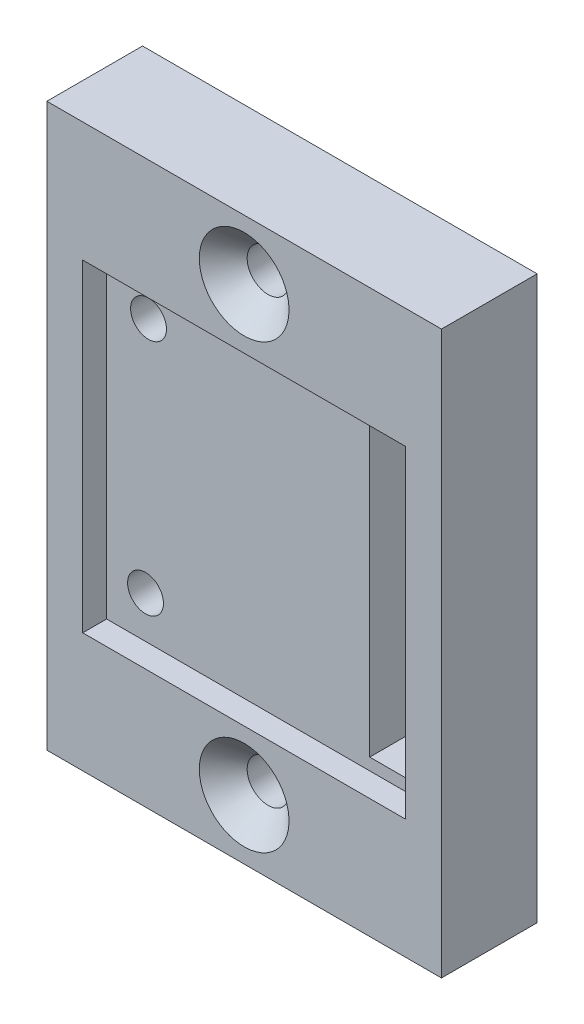
ISO-10303-21;
HEADER;
FILE_DESCRIPTION(('STEP AP214'),'2;1');
FILE_NAME('part.step','',(''),(''),'','','');
FILE_SCHEMA(('AUTOMOTIVE_DESIGN { 1 0 10303 214 1 1 1 1 }'));
ENDSEC;
DATA;
#1=APPLICATION_CONTEXT('core data for automotive mechanical design processes');
#2=APPLICATION_PROTOCOL_DEFINITION('international standard','automotive_design',2000,#1);
#3=PRODUCT_CONTEXT('',#1,'mechanical');
#4=PRODUCT('Part','Part','',(#3));
#5=PRODUCT_RELATED_PRODUCT_CATEGORY('part','',(#4));
#6=PRODUCT_DEFINITION_FORMATION('','',#4);
#7=PRODUCT_DEFINITION_CONTEXT('part definition',#1,'design');
#8=PRODUCT_DEFINITION('design','',#6,#7);
#9=PRODUCT_DEFINITION_SHAPE('','',#8);
#10=(LENGTH_UNIT() NAMED_UNIT(*) SI_UNIT(.MILLI.,.METRE.));
#11=(NAMED_UNIT(*) PLANE_ANGLE_UNIT() SI_UNIT($,.RADIAN.));
#12=(NAMED_UNIT(*) SI_UNIT($,.STERADIAN.) SOLID_ANGLE_UNIT());
#13=UNCERTAINTY_MEASURE_WITH_UNIT(LENGTH_MEASURE(1.E-05),#10,'distance_accuracy_value','');
#14=(GEOMETRIC_REPRESENTATION_CONTEXT(3) GLOBAL_UNCERTAINTY_ASSIGNED_CONTEXT((#13)) GLOBAL_UNIT_ASSIGNED_CONTEXT((#10,
#11,#12)) REPRESENTATION_CONTEXT('',''));
#15=CARTESIAN_POINT('',(0.,0.,0.));
#16=DIRECTION('',(0.,0.,1.));
#17=DIRECTION('',(1.,0.,0.));
#18=AXIS2_PLACEMENT_3D('',#15,#16,#17);
#19=CARTESIAN_POINT('',(6.25,13.5015625610399,-4.));
#20=DIRECTION('',(0.,0.,1.));
#21=DIRECTION('',(1.,0.,0.));
#22=AXIS2_PLACEMENT_3D('',#19,#20,#21);
#23=CYLINDRICAL_SURFACE('',#22,1.5);
#24=CARTESIAN_POINT('',(6.25,13.5015625610399,6.));
#25=DIRECTION('',(0.,0.,1.));
#26=DIRECTION('',(1.,0.,0.));
#27=AXIS2_PLACEMENT_3D('',#24,#25,#26);
#28=CIRCLE('',#27,1.5);
#29=CARTESIAN_POINT('',(7.75,13.5015625610399,6.));
#30=VERTEX_POINT('',#29);
#31=EDGE_CURVE('E326',#30,#30,#28,.T.);
#32=ORIENTED_EDGE('',*,*,#31,.T.);
#33=EDGE_LOOP('',(#32));
#34=FACE_BOUND('',#33,.T.);
#35=CARTESIAN_POINT('',(6.25,13.5015625610399,3.));
#36=DIRECTION('',(0.,0.,-1.));
#37=DIRECTION('',(-1.,0.,0.));
#38=AXIS2_PLACEMENT_3D('',#35,#36,#37);
#39=CIRCLE('',#38,1.5);
#40=CARTESIAN_POINT('',(4.75,13.5015625610399,3.));
#41=VERTEX_POINT('',#40);
#42=EDGE_CURVE('E39',#41,#41,#39,.F.);
#43=ORIENTED_EDGE('',*,*,#42,.F.);
#44=EDGE_LOOP('',(#43));
#45=FACE_BOUND('',#44,.T.);
#46=ADVANCED_FACE('F35',(#34,#45),#23,.F.);
#47=CARTESIAN_POINT('',(6.5,33.5,-4.));
#48=DIRECTION('',(0.,0.,1.));
#49=DIRECTION('',(1.,0.,0.));
#50=AXIS2_PLACEMENT_3D('',#47,#48,#49);
#51=CYLINDRICAL_SURFACE('',#50,1.5);
#52=CARTESIAN_POINT('',(6.5,33.5,6.));
#53=DIRECTION('',(0.,0.,1.));
#54=DIRECTION('',(1.,0.,0.));
#55=AXIS2_PLACEMENT_3D('',#52,#53,#54);
#56=CIRCLE('',#55,1.5);
#57=CARTESIAN_POINT('',(8.,33.5,6.));
#58=VERTEX_POINT('',#57);
#59=EDGE_CURVE('E335',#58,#58,#56,.T.);
#60=ORIENTED_EDGE('',*,*,#59,.T.);
#61=EDGE_LOOP('',(#60));
#62=FACE_BOUND('',#61,.T.);
#63=CARTESIAN_POINT('',(6.5,33.5,3.));
#64=DIRECTION('',(0.,0.,-1.));
#65=DIRECTION('',(-1.,0.,0.));
#66=AXIS2_PLACEMENT_3D('',#63,#64,#65);
#67=CIRCLE('',#66,1.5);
#68=CARTESIAN_POINT('',(5.,33.5,3.));
#69=VERTEX_POINT('',#68);
#70=EDGE_CURVE('E290',#69,#69,#67,.F.);
#71=ORIENTED_EDGE('',*,*,#70,.F.);
#72=EDGE_LOOP('',(#71));
#73=FACE_BOUND('',#72,.T.);
#74=ADVANCED_FACE('F419',(#62,#73),#51,.F.);
#75=CARTESIAN_POINT('',(3.,37.,8.));
#76=DIRECTION('',(1.,0.,0.));
#77=DIRECTION('',(0.,1.,0.));
#78=AXIS2_PLACEMENT_3D('',#75,#76,#77);
#79=PLANE('',#78);
#80=DIRECTION('',(0.,0.,-1.));
#81=VECTOR('',#80,1.);
#82=CARTESIAN_POINT('',(3.,10.,8.));
#83=LINE('',#82,#81);
#84=CARTESIAN_POINT('',(3.,10.,8.));
#85=VERTEX_POINT('',#84);
#86=CARTESIAN_POINT('',(3.,10.,6.));
#87=VERTEX_POINT('',#86);
#88=EDGE_CURVE('E374',#85,#87,#83,.T.);
#89=ORIENTED_EDGE('',*,*,#88,.T.);
#90=DIRECTION('',(0.,1.,0.));
#91=VECTOR('',#90,1.);
#92=CARTESIAN_POINT('',(3.,37.,6.));
#93=LINE('',#92,#91);
#94=CARTESIAN_POINT('',(3.,37.,6.));
#95=VERTEX_POINT('',#94);
#96=EDGE_CURVE('E344',#87,#95,#93,.T.);
#97=ORIENTED_EDGE('',*,*,#96,.T.);
#98=DIRECTION('',(0.,0.,-1.));
#99=VECTOR('',#98,1.);
#100=CARTESIAN_POINT('',(3.,37.,8.));
#101=LINE('',#100,#99);
#102=CARTESIAN_POINT('',(3.,37.,8.));
#103=VERTEX_POINT('',#102);
#104=EDGE_CURVE('E365',#103,#95,#101,.T.);
#105=ORIENTED_EDGE('',*,*,#104,.F.);
#106=DIRECTION('',(0.,-1.,0.));
#107=VECTOR('',#106,1.);
#108=CARTESIAN_POINT('',(3.,37.,8.));
#109=LINE('',#108,#107);
#110=EDGE_CURVE('E356',#103,#85,#109,.T.);
#111=ORIENTED_EDGE('',*,*,#110,.T.);
#112=EDGE_LOOP('',(#89,#97,#105,#111));
#113=FACE_BOUND('',#112,.T.);
#114=ADVANCED_FACE('F421',(#113),#79,.T.);
#115=CARTESIAN_POINT('',(3.,10.,8.));
#116=DIRECTION('',(0.,1.,0.));
#117=DIRECTION('',(0.,0.,1.));
#118=AXIS2_PLACEMENT_3D('',#115,#116,#117);
#119=PLANE('',#118);
#120=DIRECTION('',(0.,0.,-1.));
#121=VECTOR('',#120,1.);
#122=CARTESIAN_POINT('',(30.,10.,8.));
#123=LINE('',#122,#121);
#124=CARTESIAN_POINT('',(30.,10.,8.));
#125=VERTEX_POINT('',#124);
#126=CARTESIAN_POINT('',(30.,10.,6.));
#127=VERTEX_POINT('',#126);
#128=EDGE_CURVE('E371',#125,#127,#123,.T.);
#129=ORIENTED_EDGE('',*,*,#128,.T.);
#130=DIRECTION('',(-1.,0.,0.));
#131=VECTOR('',#130,1.);
#132=CARTESIAN_POINT('',(30.,10.,6.));
#133=LINE('',#132,#131);
#134=EDGE_CURVE('E341',#127,#87,#133,.T.);
#135=ORIENTED_EDGE('',*,*,#134,.T.);
#136=ORIENTED_EDGE('',*,*,#88,.F.);
#137=DIRECTION('',(1.,0.,0.));
#138=VECTOR('',#137,1.);
#139=CARTESIAN_POINT('',(3.,10.,8.));
#140=LINE('',#139,#138);
#141=EDGE_CURVE('E358',#85,#125,#140,.T.);
#142=ORIENTED_EDGE('',*,*,#141,.T.);
#143=EDGE_LOOP('',(#129,#135,#136,#142));
#144=FACE_BOUND('',#143,.T.);
#145=ADVANCED_FACE('F428',(#144),#119,.T.);
#146=CARTESIAN_POINT('',(30.,37.,8.));
#147=DIRECTION('',(-1.,0.,0.));
#148=DIRECTION('',(0.,0.,1.));
#149=AXIS2_PLACEMENT_3D('',#146,#147,#148);
#150=PLANE('',#149);
#151=DIRECTION('',(0.,0.,-1.));
#152=VECTOR('',#151,1.);
#153=CARTESIAN_POINT('',(30.,37.,8.));
#154=LINE('',#153,#152);
#155=CARTESIAN_POINT('',(30.,37.,8.));
#156=VERTEX_POINT('',#155);
#157=CARTESIAN_POINT('',(30.,37.,6.));
#158=VERTEX_POINT('',#157);
#159=EDGE_CURVE('E368',#156,#158,#154,.T.);
#160=ORIENTED_EDGE('',*,*,#159,.T.);
#161=DIRECTION('',(0.,-1.,0.));
#162=VECTOR('',#161,1.);
#163=CARTESIAN_POINT('',(30.,37.,6.));
#164=LINE('',#163,#162);
#165=EDGE_CURVE('E338',#158,#127,#164,.T.);
#166=ORIENTED_EDGE('',*,*,#165,.T.);
#167=ORIENTED_EDGE('',*,*,#128,.F.);
#168=DIRECTION('',(0.,1.,0.));
#169=VECTOR('',#168,1.);
#170=CARTESIAN_POINT('',(30.,37.,8.));
#171=LINE('',#170,#169);
#172=EDGE_CURVE('E360',#125,#156,#171,.T.);
#173=ORIENTED_EDGE('',*,*,#172,.T.);
#174=EDGE_LOOP('',(#160,#166,#167,#173));
#175=FACE_BOUND('',#174,.T.);
#176=ADVANCED_FACE('F453',(#175),#150,.T.);
#177=CARTESIAN_POINT('',(3.,37.,8.));
#178=DIRECTION('',(0.,-1.,0.));
#179=DIRECTION('',(0.,0.,-1.));
#180=AXIS2_PLACEMENT_3D('',#177,#178,#179);
#181=PLANE('',#180);
#182=ORIENTED_EDGE('',*,*,#104,.T.);
#183=DIRECTION('',(1.,0.,0.));
#184=VECTOR('',#183,1.);
#185=CARTESIAN_POINT('',(30.,37.,6.));
#186=LINE('',#185,#184);
#187=EDGE_CURVE('E347',#95,#158,#186,.T.);
#188=ORIENTED_EDGE('',*,*,#187,.T.);
#189=ORIENTED_EDGE('',*,*,#159,.F.);
#190=DIRECTION('',(-1.,0.,0.));
#191=VECTOR('',#190,1.);
#192=CARTESIAN_POINT('',(3.,37.,8.));
#193=LINE('',#192,#191);
#194=EDGE_CURVE('E363',#156,#103,#193,.T.);
#195=ORIENTED_EDGE('',*,*,#194,.T.);
#196=EDGE_LOOP('',(#182,#188,#189,#195));
#197=FACE_BOUND('',#196,.T.);
#198=ADVANCED_FACE('F449',(#197),#181,.T.);
#199=CARTESIAN_POINT('',(0.,0.,8.));
#200=DIRECTION('',(0.,0.,-1.));
#201=DIRECTION('',(-1.,0.,0.));
#202=AXIS2_PLACEMENT_3D('',#199,#200,#201);
#203=PLANE('',#202);
#204=CARTESIAN_POINT('',(16.5,5.,8.));
#205=DIRECTION('',(0.,0.,-1.));
#206=DIRECTION('',(-1.,0.,0.));
#207=AXIS2_PLACEMENT_3D('',#204,#205,#206);
#208=CIRCLE('',#207,3.75000000000001);
#209=CARTESIAN_POINT('',(12.75,5.,8.));
#210=VERTEX_POINT('',#209);
#211=EDGE_CURVE('E44',#210,#210,#208,.T.);
#212=ORIENTED_EDGE('',*,*,#211,.T.);
#213=EDGE_LOOP('',(#212));
#214=FACE_BOUND('',#213,.T.);
#215=CARTESIAN_POINT('',(16.5,42.,8.));
#216=DIRECTION('',(0.,0.,-1.));
#217=DIRECTION('',(-1.,0.,0.));
#218=AXIS2_PLACEMENT_3D('',#215,#216,#217);
#219=CIRCLE('',#218,3.75000000000001);
#220=CARTESIAN_POINT('',(12.75,42.,8.));
#221=VERTEX_POINT('',#220);
#222=EDGE_CURVE('E410',#221,#221,#219,.T.);
#223=ORIENTED_EDGE('',*,*,#222,.T.);
#224=EDGE_LOOP('',(#223));
#225=FACE_BOUND('',#224,.T.);
#226=DIRECTION('',(0.,-1.,0.));
#227=VECTOR('',#226,1.);
#228=CARTESIAN_POINT('',(0.,0.,8.));
#229=LINE('',#228,#227);
#230=CARTESIAN_POINT('',(0.,47.,8.));
#231=VERTEX_POINT('',#230);
#232=CARTESIAN_POINT('',(0.,0.,8.));
#233=VERTEX_POINT('',#232);
#234=EDGE_CURVE('E378',#231,#233,#229,.T.);
#235=ORIENTED_EDGE('',*,*,#234,.T.);
#236=DIRECTION('',(1.,0.,0.));
#237=VECTOR('',#236,1.);
#238=CARTESIAN_POINT('',(0.,0.,8.));
#239=LINE('',#238,#237);
#240=CARTESIAN_POINT('',(33.,0.,8.));
#241=VERTEX_POINT('',#240);
#242=EDGE_CURVE('E381',#233,#241,#239,.T.);
#243=ORIENTED_EDGE('',*,*,#242,.T.);
#244=DIRECTION('',(0.,1.,0.));
#245=VECTOR('',#244,1.);
#246=CARTESIAN_POINT('',(33.,0.,8.));
#247=LINE('',#246,#245);
#248=CARTESIAN_POINT('',(33.,47.,8.));
#249=VERTEX_POINT('',#248);
#250=EDGE_CURVE('E384',#241,#249,#247,.T.);
#251=ORIENTED_EDGE('',*,*,#250,.T.);
#252=DIRECTION('',(-1.,0.,0.));
#253=VECTOR('',#252,1.);
#254=CARTESIAN_POINT('',(0.,47.,8.));
#255=LINE('',#254,#253);
#256=EDGE_CURVE('E386',#249,#231,#255,.T.);
#257=ORIENTED_EDGE('',*,*,#256,.T.);
#258=EDGE_LOOP('',(#235,#243,#251,#257));
#259=FACE_BOUND('',#258,.T.);
#260=ORIENTED_EDGE('',*,*,#110,.F.);
#261=ORIENTED_EDGE('',*,*,#194,.F.);
#262=ORIENTED_EDGE('',*,*,#172,.F.);
#263=ORIENTED_EDGE('',*,*,#141,.F.);
#264=EDGE_LOOP('',(#260,#261,#262,#263));
#265=FACE_BOUND('',#264,.T.);
#266=ADVANCED_FACE('F452',(#214,#225,#259,#265),#203,.F.);
#267=CARTESIAN_POINT('',(0.,0.,0.));
#268=DIRECTION('',(0.,0.,-1.));
#269=DIRECTION('',(-1.,0.,0.));
#270=AXIS2_PLACEMENT_3D('',#267,#268,#269);
#271=PLANE('',#270);
#272=DIRECTION('',(0.,1.,0.));
#273=VECTOR('',#272,1.);
#274=CARTESIAN_POINT('',(3.25000000000001,11.769511753471,0.));
#275=LINE('',#274,#273);
#276=CARTESIAN_POINT('',(3.25000000000001,11.769511753471,0.));
#277=VERTEX_POINT('',#276);
#278=CARTESIAN_POINT('',(3.25000000000001,15.2336133686088,0.));
#279=VERTEX_POINT('',#278);
#280=EDGE_CURVE('E52',#277,#279,#275,.T.);
#281=ORIENTED_EDGE('',*,*,#280,.F.);
#282=DIRECTION('',(-0.866025403784438,0.5,0.));
#283=VECTOR('',#282,1.);
#284=CARTESIAN_POINT('',(6.25000000000001,10.0374609459022,0.));
#285=LINE('',#284,#283);
#286=CARTESIAN_POINT('',(6.25000000000001,10.0374609459022,0.));
#287=VERTEX_POINT('',#286);
#288=EDGE_CURVE('E220',#287,#277,#285,.T.);
#289=ORIENTED_EDGE('',*,*,#288,.F.);
#290=DIRECTION('',(-0.866025403784439,-0.5,0.));
#291=VECTOR('',#290,1.);
#292=CARTESIAN_POINT('',(9.25000000000001,11.769511753471,0.));
#293=LINE('',#292,#291);
#294=CARTESIAN_POINT('',(9.25000000000001,11.769511753471,0.));
#295=VERTEX_POINT('',#294);
#296=EDGE_CURVE('E223',#295,#287,#293,.T.);
#297=ORIENTED_EDGE('',*,*,#296,.F.);
#298=DIRECTION('',(0.,-1.,0.));
#299=VECTOR('',#298,1.);
#300=CARTESIAN_POINT('',(9.25,15.2336133686088,0.));
#301=LINE('',#300,#299);
#302=CARTESIAN_POINT('',(9.25,15.2336133686088,0.));
#303=VERTEX_POINT('',#302);
#304=EDGE_CURVE('E239',#303,#295,#301,.T.);
#305=ORIENTED_EDGE('',*,*,#304,.F.);
#306=DIRECTION('',(0.866025403784439,-0.5,0.));
#307=VECTOR('',#306,1.);
#308=CARTESIAN_POINT('',(6.25,16.9656641761777,0.));
#309=LINE('',#308,#307);
#310=CARTESIAN_POINT('',(6.25,16.9656641761777,0.));
#311=VERTEX_POINT('',#310);
#312=EDGE_CURVE('E236',#311,#303,#309,.T.);
#313=ORIENTED_EDGE('',*,*,#312,.F.);
#314=DIRECTION('',(0.866025403784439,0.5,0.));
#315=VECTOR('',#314,1.);
#316=CARTESIAN_POINT('',(3.25000000000001,15.2336133686088,0.));
#317=LINE('',#316,#315);
#318=EDGE_CURVE('E234',#279,#311,#317,.T.);
#319=ORIENTED_EDGE('',*,*,#318,.F.);
#320=EDGE_LOOP('',(#281,#289,#297,#305,#313,#319));
#321=FACE_BOUND('',#320,.T.);
#322=DIRECTION('',(0.866025403784439,0.499999999999999,0.));
#323=VECTOR('',#322,1.);
#324=CARTESIAN_POINT('',(3.5,35.2320508075689,0.));
#325=LINE('',#324,#323);
#326=CARTESIAN_POINT('',(3.5,35.2320508075689,0.));
#327=VERTEX_POINT('',#326);
#328=CARTESIAN_POINT('',(6.50000000000001,36.9641016151378,0.));
#329=VERTEX_POINT('',#328);
#330=EDGE_CURVE('E60',#327,#329,#325,.T.);
#331=ORIENTED_EDGE('',*,*,#330,.F.);
#332=DIRECTION('',(0.,1.,0.));
#333=VECTOR('',#332,1.);
#334=CARTESIAN_POINT('',(3.5,31.7679491924311,0.));
#335=LINE('',#334,#333);
#336=CARTESIAN_POINT('',(3.5,31.7679491924311,0.));
#337=VERTEX_POINT('',#336);
#338=EDGE_CURVE('E257',#337,#327,#335,.T.);
#339=ORIENTED_EDGE('',*,*,#338,.F.);
#340=DIRECTION('',(-0.866025403784439,0.499999999999999,0.));
#341=VECTOR('',#340,1.);
#342=CARTESIAN_POINT('',(6.50000000000001,30.0358983848622,0.));
#343=LINE('',#342,#341);
#344=CARTESIAN_POINT('',(6.50000000000001,30.0358983848622,0.));
#345=VERTEX_POINT('',#344);
#346=EDGE_CURVE('E283',#345,#337,#343,.T.);
#347=ORIENTED_EDGE('',*,*,#346,.F.);
#348=DIRECTION('',(-0.866025403784438,-0.500000000000001,0.));
#349=VECTOR('',#348,1.);
#350=CARTESIAN_POINT('',(9.50000000000001,31.7679491924311,0.));
#351=LINE('',#350,#349);
#352=CARTESIAN_POINT('',(9.50000000000001,31.7679491924311,0.));
#353=VERTEX_POINT('',#352);
#354=EDGE_CURVE('E280',#353,#345,#351,.T.);
#355=ORIENTED_EDGE('',*,*,#354,.F.);
#356=DIRECTION('',(0.,-1.,0.));
#357=VECTOR('',#356,1.);
#358=CARTESIAN_POINT('',(9.50000000000001,35.2320508075689,0.));
#359=LINE('',#358,#357);
#360=CARTESIAN_POINT('',(9.50000000000001,35.2320508075689,0.));
#361=VERTEX_POINT('',#360);
#362=EDGE_CURVE('E277',#361,#353,#359,.T.);
#363=ORIENTED_EDGE('',*,*,#362,.F.);
#364=DIRECTION('',(0.866025403784439,-0.499999999999999,0.));
#365=VECTOR('',#364,1.);
#366=CARTESIAN_POINT('',(6.50000000000001,36.9641016151378,0.));
#367=LINE('',#366,#365);
#368=EDGE_CURVE('E274',#329,#361,#367,.T.);
#369=ORIENTED_EDGE('',*,*,#368,.F.);
#370=EDGE_LOOP('',(#331,#339,#347,#355,#363,#369));
#371=FACE_BOUND('',#370,.T.);
#372=CARTESIAN_POINT('',(16.5,42.,0.));
#373=DIRECTION('',(0.,0.,1.));
#374=DIRECTION('',(1.,0.,0.));
#375=AXIS2_PLACEMENT_3D('',#372,#373,#374);
#376=CIRCLE('',#375,1.75);
#377=CARTESIAN_POINT('',(18.25,42.,0.));
#378=VERTEX_POINT('',#377);
#379=EDGE_CURVE('E353',#378,#378,#376,.T.);
#380=ORIENTED_EDGE('',*,*,#379,.T.);
#381=EDGE_LOOP('',(#380));
#382=FACE_BOUND('',#381,.T.);
#383=DIRECTION('',(0.,-1.,0.));
#384=VECTOR('',#383,1.);
#385=CARTESIAN_POINT('',(0.,0.,0.));
#386=LINE('',#385,#384);
#387=CARTESIAN_POINT('',(0.,47.,0.));
#388=VERTEX_POINT('',#387);
#389=CARTESIAN_POINT('',(0.,0.,0.));
#390=VERTEX_POINT('',#389);
#391=EDGE_CURVE('E377',#388,#390,#386,.T.);
#392=ORIENTED_EDGE('',*,*,#391,.F.);
#393=DIRECTION('',(-1.,0.,0.));
#394=VECTOR('',#393,1.);
#395=CARTESIAN_POINT('',(0.,47.,0.));
#396=LINE('',#395,#394);
#397=CARTESIAN_POINT('',(33.,47.,0.));
#398=VERTEX_POINT('',#397);
#399=EDGE_CURVE('E382',#398,#388,#396,.T.);
#400=ORIENTED_EDGE('',*,*,#399,.F.);
#401=DIRECTION('',(0.,1.,0.));
#402=VECTOR('',#401,1.);
#403=CARTESIAN_POINT('',(33.,0.,0.));
#404=LINE('',#403,#402);
#405=CARTESIAN_POINT('',(33.,0.,0.));
#406=VERTEX_POINT('',#405);
#407=EDGE_CURVE('E393',#406,#398,#404,.T.);
#408=ORIENTED_EDGE('',*,*,#407,.F.);
#409=DIRECTION('',(1.,0.,0.));
#410=VECTOR('',#409,1.);
#411=CARTESIAN_POINT('',(0.,0.,0.));
#412=LINE('',#411,#410);
#413=EDGE_CURVE('E391',#390,#406,#412,.T.);
#414=ORIENTED_EDGE('',*,*,#413,.F.);
#415=EDGE_LOOP('',(#392,#400,#408,#414));
#416=FACE_BOUND('',#415,.T.);
#417=CARTESIAN_POINT('',(16.5,5.,0.));
#418=DIRECTION('',(0.,0.,1.));
#419=DIRECTION('',(1.,0.,0.));
#420=AXIS2_PLACEMENT_3D('',#417,#418,#419);
#421=CIRCLE('',#420,1.75);
#422=CARTESIAN_POINT('',(18.25,5.,0.));
#423=VERTEX_POINT('',#422);
#424=EDGE_CURVE('E350',#423,#423,#421,.T.);
#425=ORIENTED_EDGE('',*,*,#424,.T.);
#426=EDGE_LOOP('',(#425));
#427=FACE_BOUND('',#426,.T.);
#428=ADVANCED_FACE('F463',(#321,#371,#382,#416,#427),#271,.T.);
#429=CARTESIAN_POINT('',(0.,0.,8.));
#430=DIRECTION('',(1.,0.,0.));
#431=DIRECTION('',(0.,0.,-1.));
#432=AXIS2_PLACEMENT_3D('',#429,#430,#431);
#433=PLANE('',#432);
#434=ORIENTED_EDGE('',*,*,#391,.T.);
#435=DIRECTION('',(0.,0.,-1.));
#436=VECTOR('',#435,1.);
#437=CARTESIAN_POINT('',(0.,0.,8.));
#438=LINE('',#437,#436);
#439=EDGE_CURVE('E404',#233,#390,#438,.T.);
#440=ORIENTED_EDGE('',*,*,#439,.F.);
#441=ORIENTED_EDGE('',*,*,#234,.F.);
#442=DIRECTION('',(0.,0.,-1.));
#443=VECTOR('',#442,1.);
#444=CARTESIAN_POINT('',(0.,47.,8.));
#445=LINE('',#444,#443);
#446=EDGE_CURVE('E388',#231,#388,#445,.T.);
#447=ORIENTED_EDGE('',*,*,#446,.T.);
#448=EDGE_LOOP('',(#434,#440,#441,#447));
#449=FACE_BOUND('',#448,.T.);
#450=ADVANCED_FACE('F467',(#449),#433,.F.);
#451=CARTESIAN_POINT('',(0.,0.,8.));
#452=DIRECTION('',(0.,1.,0.));
#453=DIRECTION('',(0.,0.,1.));
#454=AXIS2_PLACEMENT_3D('',#451,#452,#453);
#455=PLANE('',#454);
#456=ORIENTED_EDGE('',*,*,#413,.T.);
#457=DIRECTION('',(0.,0.,-1.));
#458=VECTOR('',#457,1.);
#459=CARTESIAN_POINT('',(33.,0.,8.));
#460=LINE('',#459,#458);
#461=EDGE_CURVE('E401',#241,#406,#460,.T.);
#462=ORIENTED_EDGE('',*,*,#461,.F.);
#463=ORIENTED_EDGE('',*,*,#242,.F.);
#464=ORIENTED_EDGE('',*,*,#439,.T.);
#465=EDGE_LOOP('',(#456,#462,#463,#464));
#466=FACE_BOUND('',#465,.T.);
#467=ADVANCED_FACE('F475',(#466),#455,.F.);
#468=CARTESIAN_POINT('',(33.,0.,8.));
#469=DIRECTION('',(-1.,0.,0.));
#470=DIRECTION('',(0.,0.,1.));
#471=AXIS2_PLACEMENT_3D('',#468,#469,#470);
#472=PLANE('',#471);
#473=ORIENTED_EDGE('',*,*,#407,.T.);
#474=DIRECTION('',(0.,0.,-1.));
#475=VECTOR('',#474,1.);
#476=CARTESIAN_POINT('',(33.,47.,8.));
#477=LINE('',#476,#475);
#478=EDGE_CURVE('E398',#249,#398,#477,.T.);
#479=ORIENTED_EDGE('',*,*,#478,.F.);
#480=ORIENTED_EDGE('',*,*,#250,.F.);
#481=ORIENTED_EDGE('',*,*,#461,.T.);
#482=EDGE_LOOP('',(#473,#479,#480,#481));
#483=FACE_BOUND('',#482,.T.);
#484=ADVANCED_FACE('F471',(#483),#472,.F.);
#485=CARTESIAN_POINT('',(0.,47.,8.));
#486=DIRECTION('',(0.,-1.,0.));
#487=DIRECTION('',(1.,0.,0.));
#488=AXIS2_PLACEMENT_3D('',#485,#486,#487);
#489=PLANE('',#488);
#490=ORIENTED_EDGE('',*,*,#399,.T.);
#491=ORIENTED_EDGE('',*,*,#446,.F.);
#492=ORIENTED_EDGE('',*,*,#256,.F.);
#493=ORIENTED_EDGE('',*,*,#478,.T.);
#494=EDGE_LOOP('',(#490,#491,#492,#493));
#495=FACE_BOUND('',#494,.T.);
#496=ADVANCED_FACE('F447',(#495),#489,.F.);
#497=CARTESIAN_POINT('',(16.5,42.,8.));
#498=DIRECTION('',(0.,0.,-1.));
#499=DIRECTION('',(-1.,0.,0.));
#500=AXIS2_PLACEMENT_3D('',#497,#498,#499);
#501=CYLINDRICAL_SURFACE('',#500,1.75);
#502=CARTESIAN_POINT('',(16.5,42.,6.));
#503=DIRECTION('',(0.,0.,-1.));
#504=DIRECTION('',(-1.,0.,0.));
#505=AXIS2_PLACEMENT_3D('',#502,#503,#504);
#506=CIRCLE('',#505,1.75);
#507=CARTESIAN_POINT('',(14.75,42.,6.));
#508=VERTEX_POINT('',#507);
#509=EDGE_CURVE('E11',#508,#508,#506,.F.);
#510=ORIENTED_EDGE('',*,*,#509,.T.);
#511=EDGE_LOOP('',(#510));
#512=FACE_BOUND('',#511,.T.);
#513=ORIENTED_EDGE('',*,*,#379,.F.);
#514=EDGE_LOOP('',(#513));
#515=FACE_BOUND('',#514,.T.);
#516=ADVANCED_FACE('F443',(#512,#515),#501,.F.);
#517=CARTESIAN_POINT('',(16.5,5.,8.));
#518=DIRECTION('',(0.,0.,-1.));
#519=DIRECTION('',(-1.,0.,0.));
#520=AXIS2_PLACEMENT_3D('',#517,#518,#519);
#521=CYLINDRICAL_SURFACE('',#520,1.75);
#522=CARTESIAN_POINT('',(16.5,5.,6.));
#523=DIRECTION('',(0.,0.,-1.));
#524=DIRECTION('',(-1.,0.,0.));
#525=AXIS2_PLACEMENT_3D('',#522,#523,#524);
#526=CIRCLE('',#525,1.75);
#527=CARTESIAN_POINT('',(14.75,5.,6.));
#528=VERTEX_POINT('',#527);
#529=EDGE_CURVE('E407',#528,#528,#526,.F.);
#530=ORIENTED_EDGE('',*,*,#529,.T.);
#531=EDGE_LOOP('',(#530));
#532=FACE_BOUND('',#531,.T.);
#533=ORIENTED_EDGE('',*,*,#424,.F.);
#534=EDGE_LOOP('',(#533));
#535=FACE_BOUND('',#534,.T.);
#536=ADVANCED_FACE('F439',(#532,#535),#521,.F.);
#537=CARTESIAN_POINT('',(0.,0.,6.));
#538=DIRECTION('',(0.,0.,-1.));
#539=DIRECTION('',(-1.,0.,0.));
#540=AXIS2_PLACEMENT_3D('',#537,#538,#539);
#541=PLANE('',#540);
#542=DIRECTION('',(-1.,0.,0.));
#543=VECTOR('',#542,1.);
#544=CARTESIAN_POINT('',(29.,36.,6.));
#545=LINE('',#544,#543);
#546=CARTESIAN_POINT('',(29.,36.,6.));
#547=VERTEX_POINT('',#546);
#548=CARTESIAN_POINT('',(25.,36.,6.));
#549=VERTEX_POINT('',#548);
#550=EDGE_CURVE('E316',#547,#549,#545,.T.);
#551=ORIENTED_EDGE('',*,*,#550,.F.);
#552=DIRECTION('',(0.,1.,0.));
#553=VECTOR('',#552,1.);
#554=CARTESIAN_POINT('',(29.,36.,6.));
#555=LINE('',#554,#553);
#556=CARTESIAN_POINT('',(29.,11.,6.));
#557=VERTEX_POINT('',#556);
#558=EDGE_CURVE('E314',#557,#547,#555,.T.);
#559=ORIENTED_EDGE('',*,*,#558,.F.);
#560=DIRECTION('',(1.,0.,0.));
#561=VECTOR('',#560,1.);
#562=CARTESIAN_POINT('',(29.,11.,6.));
#563=LINE('',#562,#561);
#564=CARTESIAN_POINT('',(25.,11.,6.));
#565=VERTEX_POINT('',#564);
#566=EDGE_CURVE('E304',#565,#557,#563,.T.);
#567=ORIENTED_EDGE('',*,*,#566,.F.);
#568=DIRECTION('',(0.,-1.,0.));
#569=VECTOR('',#568,1.);
#570=CARTESIAN_POINT('',(25.,36.,6.));
#571=LINE('',#570,#569);
#572=EDGE_CURVE('E319',#549,#565,#571,.T.);
#573=ORIENTED_EDGE('',*,*,#572,.F.);
#574=EDGE_LOOP('',(#551,#559,#567,#573));
#575=FACE_BOUND('',#574,.T.);
#576=ORIENTED_EDGE('',*,*,#31,.F.);
#577=EDGE_LOOP('',(#576));
#578=FACE_BOUND('',#577,.T.);
#579=ORIENTED_EDGE('',*,*,#59,.F.);
#580=EDGE_LOOP('',(#579));
#581=FACE_BOUND('',#580,.T.);
#582=ORIENTED_EDGE('',*,*,#165,.F.);
#583=ORIENTED_EDGE('',*,*,#187,.F.);
#584=ORIENTED_EDGE('',*,*,#96,.F.);
#585=ORIENTED_EDGE('',*,*,#134,.F.);
#586=EDGE_LOOP('',(#582,#583,#584,#585));
#587=FACE_BOUND('',#586,.T.);
#588=ADVANCED_FACE('F435',(#575,#578,#581,#587),#541,.F.);
#589=CARTESIAN_POINT('',(16.5,5.,6.));
#590=DIRECTION('',(0.,0.,1.));
#591=DIRECTION('',(1.,0.,0.));
#592=AXIS2_PLACEMENT_3D('',#589,#590,#591);
#593=CONICAL_SURFACE('',#592,1.75,0.78539816339745);
#594=ORIENTED_EDGE('',*,*,#211,.F.);
#595=EDGE_LOOP('',(#594));
#596=FACE_BOUND('',#595,.T.);
#597=ORIENTED_EDGE('',*,*,#529,.F.);
#598=EDGE_LOOP('',(#597));
#599=FACE_BOUND('',#598,.T.);
#600=ADVANCED_FACE('F438',(#596,#599),#593,.F.);
#601=CARTESIAN_POINT('',(16.5,42.,6.));
#602=DIRECTION('',(0.,0.,1.));
#603=DIRECTION('',(1.,0.,0.));
#604=AXIS2_PLACEMENT_3D('',#601,#602,#603);
#605=CONICAL_SURFACE('',#604,1.75,0.78539816339745);
#606=ORIENTED_EDGE('',*,*,#222,.F.);
#607=EDGE_LOOP('',(#606));
#608=FACE_BOUND('',#607,.T.);
#609=ORIENTED_EDGE('',*,*,#509,.F.);
#610=EDGE_LOOP('',(#609));
#611=FACE_BOUND('',#610,.T.);
#612=ADVANCED_FACE('F37',(#608,#611),#605,.F.);
#613=CARTESIAN_POINT('',(29.,36.,3.));
#614=DIRECTION('',(1.,0.,0.));
#615=DIRECTION('',(0.,0.,-1.));
#616=AXIS2_PLACEMENT_3D('',#613,#614,#615);
#617=PLANE('',#616);
#618=ORIENTED_EDGE('',*,*,#558,.T.);
#619=DIRECTION('',(0.,0.,1.));
#620=VECTOR('',#619,1.);
#621=CARTESIAN_POINT('',(29.,36.,3.));
#622=LINE('',#621,#620);
#623=CARTESIAN_POINT('',(29.,36.,3.));
#624=VERTEX_POINT('',#623);
#625=EDGE_CURVE('E313',#624,#547,#622,.T.);
#626=ORIENTED_EDGE('',*,*,#625,.F.);
#627=DIRECTION('',(0.,1.,0.));
#628=VECTOR('',#627,1.);
#629=CARTESIAN_POINT('',(29.,36.,3.));
#630=LINE('',#629,#628);
#631=CARTESIAN_POINT('',(29.,11.,3.));
#632=VERTEX_POINT('',#631);
#633=EDGE_CURVE('E300',#632,#624,#630,.T.);
#634=ORIENTED_EDGE('',*,*,#633,.F.);
#635=DIRECTION('',(0.,0.,1.));
#636=VECTOR('',#635,1.);
#637=CARTESIAN_POINT('',(29.,11.,3.));
#638=LINE('',#637,#636);
#639=EDGE_CURVE('E324',#632,#557,#638,.T.);
#640=ORIENTED_EDGE('',*,*,#639,.T.);
#641=EDGE_LOOP('',(#618,#626,#634,#640));
#642=FACE_BOUND('',#641,.T.);
#643=ADVANCED_FACE('F487',(#642),#617,.F.);
#644=CARTESIAN_POINT('',(29.,11.,3.));
#645=DIRECTION('',(0.,-1.,0.));
#646=DIRECTION('',(0.,0.,-1.));
#647=AXIS2_PLACEMENT_3D('',#644,#645,#646);
#648=PLANE('',#647);
#649=ORIENTED_EDGE('',*,*,#566,.T.);
#650=ORIENTED_EDGE('',*,*,#639,.F.);
#651=DIRECTION('',(1.,0.,0.));
#652=VECTOR('',#651,1.);
#653=CARTESIAN_POINT('',(29.,11.,3.));
#654=LINE('',#653,#652);
#655=CARTESIAN_POINT('',(25.,11.,3.));
#656=VERTEX_POINT('',#655);
#657=EDGE_CURVE('E310',#656,#632,#654,.T.);
#658=ORIENTED_EDGE('',*,*,#657,.F.);
#659=DIRECTION('',(0.,0.,1.));
#660=VECTOR('',#659,1.);
#661=CARTESIAN_POINT('',(25.,11.,3.));
#662=LINE('',#661,#660);
#663=EDGE_CURVE('E327',#656,#565,#662,.T.);
#664=ORIENTED_EDGE('',*,*,#663,.T.);
#665=EDGE_LOOP('',(#649,#650,#658,#664));
#666=FACE_BOUND('',#665,.T.);
#667=ADVANCED_FACE('F526',(#666),#648,.F.);
#668=CARTESIAN_POINT('',(25.,36.,3.));
#669=DIRECTION('',(-1.,0.,0.));
#670=DIRECTION('',(0.,-1.,0.));
#671=AXIS2_PLACEMENT_3D('',#668,#669,#670);
#672=PLANE('',#671);
#673=ORIENTED_EDGE('',*,*,#572,.T.);
#674=ORIENTED_EDGE('',*,*,#663,.F.);
#675=DIRECTION('',(0.,-1.,0.));
#676=VECTOR('',#675,1.);
#677=CARTESIAN_POINT('',(25.,36.,3.));
#678=LINE('',#677,#676);
#679=CARTESIAN_POINT('',(25.,36.,3.));
#680=VERTEX_POINT('',#679);
#681=EDGE_CURVE('E307',#680,#656,#678,.T.);
#682=ORIENTED_EDGE('',*,*,#681,.F.);
#683=DIRECTION('',(0.,0.,1.));
#684=VECTOR('',#683,1.);
#685=CARTESIAN_POINT('',(25.,36.,3.));
#686=LINE('',#685,#684);
#687=EDGE_CURVE('E329',#680,#549,#686,.T.);
#688=ORIENTED_EDGE('',*,*,#687,.T.);
#689=EDGE_LOOP('',(#673,#674,#682,#688));
#690=FACE_BOUND('',#689,.T.);
#691=ADVANCED_FACE('F531',(#690),#672,.F.);
#692=CARTESIAN_POINT('',(29.,36.,3.));
#693=DIRECTION('',(0.,1.,0.));
#694=DIRECTION('',(0.,0.,1.));
#695=AXIS2_PLACEMENT_3D('',#692,#693,#694);
#696=PLANE('',#695);
#697=ORIENTED_EDGE('',*,*,#550,.T.);
#698=ORIENTED_EDGE('',*,*,#687,.F.);
#699=DIRECTION('',(-1.,0.,0.));
#700=VECTOR('',#699,1.);
#701=CARTESIAN_POINT('',(29.,36.,3.));
#702=LINE('',#701,#700);
#703=EDGE_CURVE('E303',#624,#680,#702,.T.);
#704=ORIENTED_EDGE('',*,*,#703,.F.);
#705=ORIENTED_EDGE('',*,*,#625,.T.);
#706=EDGE_LOOP('',(#697,#698,#704,#705));
#707=FACE_BOUND('',#706,.T.);
#708=ADVANCED_FACE('F535',(#707),#696,.F.);
#709=CARTESIAN_POINT('',(0.,0.,3.));
#710=DIRECTION('',(0.,0.,-1.));
#711=DIRECTION('',(-1.,0.,0.));
#712=AXIS2_PLACEMENT_3D('',#709,#710,#711);
#713=PLANE('',#712);
#714=ORIENTED_EDGE('',*,*,#633,.T.);
#715=ORIENTED_EDGE('',*,*,#703,.T.);
#716=ORIENTED_EDGE('',*,*,#681,.T.);
#717=ORIENTED_EDGE('',*,*,#657,.T.);
#718=EDGE_LOOP('',(#714,#715,#716,#717));
#719=FACE_BOUND('',#718,.T.);
#720=ADVANCED_FACE('F538',(#719),#713,.F.);
#721=CARTESIAN_POINT('',(0.,0.,3.));
#722=DIRECTION('',(0.,0.,-1.));
#723=DIRECTION('',(-1.,0.,0.));
#724=AXIS2_PLACEMENT_3D('',#721,#722,#723);
#725=PLANE('',#724);
#726=DIRECTION('',(0.866025403784439,0.499999999999999,0.));
#727=VECTOR('',#726,1.);
#728=CARTESIAN_POINT('',(3.5,35.2320508075689,3.));
#729=LINE('',#728,#727);
#730=CARTESIAN_POINT('',(3.5,35.2320508075689,3.));
#731=VERTEX_POINT('',#730);
#732=CARTESIAN_POINT('',(6.50000000000001,36.9641016151378,3.));
#733=VERTEX_POINT('',#732);
#734=EDGE_CURVE('E253',#731,#733,#729,.T.);
#735=ORIENTED_EDGE('',*,*,#734,.T.);
#736=DIRECTION('',(0.866025403784439,-0.499999999999999,0.));
#737=VECTOR('',#736,1.);
#738=CARTESIAN_POINT('',(6.50000000000001,36.9641016151378,3.));
#739=LINE('',#738,#737);
#740=CARTESIAN_POINT('',(9.50000000000001,35.2320508075689,3.));
#741=VERTEX_POINT('',#740);
#742=EDGE_CURVE('E256',#733,#741,#739,.T.);
#743=ORIENTED_EDGE('',*,*,#742,.T.);
#744=DIRECTION('',(0.,-1.,0.));
#745=VECTOR('',#744,1.);
#746=CARTESIAN_POINT('',(9.50000000000001,35.2320508075689,3.));
#747=LINE('',#746,#745);
#748=CARTESIAN_POINT('',(9.50000000000001,31.7679491924311,3.));
#749=VERTEX_POINT('',#748);
#750=EDGE_CURVE('E260',#741,#749,#747,.T.);
#751=ORIENTED_EDGE('',*,*,#750,.T.);
#752=DIRECTION('',(-0.866025403784438,-0.500000000000001,0.));
#753=VECTOR('',#752,1.);
#754=CARTESIAN_POINT('',(9.50000000000001,31.7679491924311,3.));
#755=LINE('',#754,#753);
#756=CARTESIAN_POINT('',(6.50000000000001,30.0358983848622,3.));
#757=VERTEX_POINT('',#756);
#758=EDGE_CURVE('E263',#749,#757,#755,.T.);
#759=ORIENTED_EDGE('',*,*,#758,.T.);
#760=DIRECTION('',(-0.866025403784439,0.499999999999999,0.));
#761=VECTOR('',#760,1.);
#762=CARTESIAN_POINT('',(6.50000000000001,30.0358983848622,3.));
#763=LINE('',#762,#761);
#764=CARTESIAN_POINT('',(3.5,31.7679491924311,3.));
#765=VERTEX_POINT('',#764);
#766=EDGE_CURVE('E266',#757,#765,#763,.T.);
#767=ORIENTED_EDGE('',*,*,#766,.T.);
#768=DIRECTION('',(0.,1.,0.));
#769=VECTOR('',#768,1.);
#770=CARTESIAN_POINT('',(3.5,31.7679491924311,3.));
#771=LINE('',#770,#769);
#772=EDGE_CURVE('E269',#765,#731,#771,.T.);
#773=ORIENTED_EDGE('',*,*,#772,.T.);
#774=EDGE_LOOP('',(#735,#743,#751,#759,#767,#773));
#775=FACE_BOUND('',#774,.T.);
#776=ORIENTED_EDGE('',*,*,#70,.T.);
#777=EDGE_LOOP('',(#776));
#778=FACE_BOUND('',#777,.T.);
#779=ADVANCED_FACE('F417',(#775,#778),#725,.T.);
#780=CARTESIAN_POINT('',(3.5,35.2320508075689,3.));
#781=DIRECTION('',(-0.499999999999999,0.866025403784439,0.));
#782=DIRECTION('',(-0.866025403784439,-0.499999999999999,0.));
#783=AXIS2_PLACEMENT_3D('',#780,#781,#782);
#784=PLANE('',#783);
#785=ORIENTED_EDGE('',*,*,#330,.T.);
#786=DIRECTION('',(0.,0.,-1.));
#787=VECTOR('',#786,1.);
#788=CARTESIAN_POINT('',(6.50000000000001,36.9641016151378,3.));
#789=LINE('',#788,#787);
#790=EDGE_CURVE('E272',#733,#329,#789,.T.);
#791=ORIENTED_EDGE('',*,*,#790,.F.);
#792=ORIENTED_EDGE('',*,*,#734,.F.);
#793=DIRECTION('',(0.,0.,-1.));
#794=VECTOR('',#793,1.);
#795=CARTESIAN_POINT('',(3.5,35.2320508075689,3.));
#796=LINE('',#795,#794);
#797=EDGE_CURVE('E288',#731,#327,#796,.T.);
#798=ORIENTED_EDGE('',*,*,#797,.T.);
#799=EDGE_LOOP('',(#785,#791,#792,#798));
#800=FACE_BOUND('',#799,.T.);
#801=ADVANCED_FACE('F546',(#800),#784,.F.);
#802=CARTESIAN_POINT('',(3.5,31.7679491924311,3.));
#803=DIRECTION('',(-1.,0.,0.));
#804=DIRECTION('',(0.,-1.,0.));
#805=AXIS2_PLACEMENT_3D('',#802,#803,#804);
#806=PLANE('',#805);
#807=ORIENTED_EDGE('',*,*,#338,.T.);
#808=ORIENTED_EDGE('',*,*,#797,.F.);
#809=ORIENTED_EDGE('',*,*,#772,.F.);
#810=DIRECTION('',(0.,0.,-1.));
#811=VECTOR('',#810,1.);
#812=CARTESIAN_POINT('',(3.5,31.7679491924311,3.));
#813=LINE('',#812,#811);
#814=EDGE_CURVE('E291',#765,#337,#813,.T.);
#815=ORIENTED_EDGE('',*,*,#814,.T.);
#816=EDGE_LOOP('',(#807,#808,#809,#815));
#817=FACE_BOUND('',#816,.T.);
#818=ADVANCED_FACE('F549',(#817),#806,.F.);
#819=CARTESIAN_POINT('',(6.50000000000001,30.0358983848622,3.));
#820=DIRECTION('',(-0.499999999999999,-0.866025403784439,0.));
#821=DIRECTION('',(0.866025403784439,-0.499999999999999,0.));
#822=AXIS2_PLACEMENT_3D('',#819,#820,#821);
#823=PLANE('',#822);
#824=ORIENTED_EDGE('',*,*,#346,.T.);
#825=ORIENTED_EDGE('',*,*,#814,.F.);
#826=ORIENTED_EDGE('',*,*,#766,.F.);
#827=DIRECTION('',(0.,0.,-1.));
#828=VECTOR('',#827,1.);
#829=CARTESIAN_POINT('',(6.50000000000001,30.0358983848622,3.));
#830=LINE('',#829,#828);
#831=EDGE_CURVE('E293',#757,#345,#830,.T.);
#832=ORIENTED_EDGE('',*,*,#831,.T.);
#833=EDGE_LOOP('',(#824,#825,#826,#832));
#834=FACE_BOUND('',#833,.T.);
#835=ADVANCED_FACE('F561',(#834),#823,.F.);
#836=CARTESIAN_POINT('',(9.50000000000001,31.7679491924311,3.));
#837=DIRECTION('',(0.500000000000001,-0.866025403784438,0.));
#838=DIRECTION('',(0.866025403784438,0.500000000000001,0.));
#839=AXIS2_PLACEMENT_3D('',#836,#837,#838);
#840=PLANE('',#839);
#841=ORIENTED_EDGE('',*,*,#354,.T.);
#842=ORIENTED_EDGE('',*,*,#831,.F.);
#843=ORIENTED_EDGE('',*,*,#758,.F.);
#844=DIRECTION('',(0.,0.,-1.));
#845=VECTOR('',#844,1.);
#846=CARTESIAN_POINT('',(9.50000000000001,31.7679491924311,3.));
#847=LINE('',#846,#845);
#848=EDGE_CURVE('E295',#749,#353,#847,.T.);
#849=ORIENTED_EDGE('',*,*,#848,.T.);
#850=EDGE_LOOP('',(#841,#842,#843,#849));
#851=FACE_BOUND('',#850,.T.);
#852=ADVANCED_FACE('F557',(#851),#840,.F.);
#853=CARTESIAN_POINT('',(9.50000000000001,35.2320508075689,3.));
#854=DIRECTION('',(1.,0.,0.));
#855=DIRECTION('',(0.,1.,0.));
#856=AXIS2_PLACEMENT_3D('',#853,#854,#855);
#857=PLANE('',#856);
#858=ORIENTED_EDGE('',*,*,#362,.T.);
#859=ORIENTED_EDGE('',*,*,#848,.F.);
#860=ORIENTED_EDGE('',*,*,#750,.F.);
#861=DIRECTION('',(0.,0.,-1.));
#862=VECTOR('',#861,1.);
#863=CARTESIAN_POINT('',(9.50000000000001,35.2320508075689,3.));
#864=LINE('',#863,#862);
#865=EDGE_CURVE('E297',#741,#361,#864,.T.);
#866=ORIENTED_EDGE('',*,*,#865,.T.);
#867=EDGE_LOOP('',(#858,#859,#860,#866));
#868=FACE_BOUND('',#867,.T.);
#869=ADVANCED_FACE('F553',(#868),#857,.F.);
#870=CARTESIAN_POINT('',(6.50000000000001,36.9641016151378,3.));
#871=DIRECTION('',(0.499999999999999,0.866025403784439,0.));
#872=DIRECTION('',(-0.866025403784439,0.499999999999999,0.));
#873=AXIS2_PLACEMENT_3D('',#870,#871,#872);
#874=PLANE('',#873);
#875=ORIENTED_EDGE('',*,*,#368,.T.);
#876=ORIENTED_EDGE('',*,*,#865,.F.);
#877=ORIENTED_EDGE('',*,*,#742,.F.);
#878=ORIENTED_EDGE('',*,*,#790,.T.);
#879=EDGE_LOOP('',(#875,#876,#877,#878));
#880=FACE_BOUND('',#879,.T.);
#881=ADVANCED_FACE('F550',(#880),#874,.F.);
#882=CARTESIAN_POINT('',(0.,0.,3.));
#883=DIRECTION('',(0.,0.,-1.));
#884=DIRECTION('',(-1.,0.,0.));
#885=AXIS2_PLACEMENT_3D('',#882,#883,#884);
#886=PLANE('',#885);
#887=DIRECTION('',(0.,1.,0.));
#888=VECTOR('',#887,1.);
#889=CARTESIAN_POINT('',(3.25000000000001,11.769511753471,3.));
#890=LINE('',#889,#888);
#891=CARTESIAN_POINT('',(3.25000000000001,11.769511753471,3.));
#892=VERTEX_POINT('',#891);
#893=CARTESIAN_POINT('',(3.25000000000001,15.2336133686088,3.));
#894=VERTEX_POINT('',#893);
#895=EDGE_CURVE('E200',#892,#894,#890,.T.);
#896=ORIENTED_EDGE('',*,*,#895,.T.);
#897=DIRECTION('',(0.866025403784439,0.5,0.));
#898=VECTOR('',#897,1.);
#899=CARTESIAN_POINT('',(3.25000000000001,15.2336133686088,3.));
#900=LINE('',#899,#898);
#901=CARTESIAN_POINT('',(6.25,16.9656641761777,3.));
#902=VERTEX_POINT('',#901);
#903=EDGE_CURVE('E209',#894,#902,#900,.T.);
#904=ORIENTED_EDGE('',*,*,#903,.T.);
#905=DIRECTION('',(0.866025403784439,-0.5,0.));
#906=VECTOR('',#905,1.);
#907=CARTESIAN_POINT('',(6.25,16.9656641761777,3.));
#908=LINE('',#907,#906);
#909=CARTESIAN_POINT('',(9.25,15.2336133686088,3.));
#910=VERTEX_POINT('',#909);
#911=EDGE_CURVE('E214',#902,#910,#908,.T.);
#912=ORIENTED_EDGE('',*,*,#911,.T.);
#913=DIRECTION('',(0.,-1.,0.));
#914=VECTOR('',#913,1.);
#915=CARTESIAN_POINT('',(9.25,15.2336133686088,3.));
#916=LINE('',#915,#914);
#917=CARTESIAN_POINT('',(9.25000000000001,11.769511753471,3.));
#918=VERTEX_POINT('',#917);
#919=EDGE_CURVE('E227',#910,#918,#916,.T.);
#920=ORIENTED_EDGE('',*,*,#919,.T.);
#921=DIRECTION('',(-0.866025403784439,-0.5,0.));
#922=VECTOR('',#921,1.);
#923=CARTESIAN_POINT('',(9.25000000000001,11.769511753471,3.));
#924=LINE('',#923,#922);
#925=CARTESIAN_POINT('',(6.25000000000001,10.0374609459022,3.));
#926=VERTEX_POINT('',#925);
#927=EDGE_CURVE('E230',#918,#926,#924,.T.);
#928=ORIENTED_EDGE('',*,*,#927,.T.);
#929=DIRECTION('',(-0.866025403784438,0.5,0.));
#930=VECTOR('',#929,1.);
#931=CARTESIAN_POINT('',(6.25000000000001,10.0374609459022,3.));
#932=LINE('',#931,#930);
#933=EDGE_CURVE('E206',#926,#892,#932,.T.);
#934=ORIENTED_EDGE('',*,*,#933,.T.);
#935=EDGE_LOOP('',(#896,#904,#912,#920,#928,#934));
#936=FACE_BOUND('',#935,.T.);
#937=ORIENTED_EDGE('',*,*,#42,.T.);
#938=EDGE_LOOP('',(#937));
#939=FACE_BOUND('',#938,.T.);
#940=ADVANCED_FACE('F216',(#936,#939),#886,.T.);
#941=CARTESIAN_POINT('',(3.25000000000001,11.769511753471,3.));
#942=DIRECTION('',(-1.,0.,0.));
#943=DIRECTION('',(0.,-1.,0.));
#944=AXIS2_PLACEMENT_3D('',#941,#942,#943);
#945=PLANE('',#944);
#946=ORIENTED_EDGE('',*,*,#280,.T.);
#947=DIRECTION('',(0.,0.,-1.));
#948=VECTOR('',#947,1.);
#949=CARTESIAN_POINT('',(3.25000000000001,15.2336133686088,3.));
#950=LINE('',#949,#948);
#951=EDGE_CURVE('E196',#894,#279,#950,.T.);
#952=ORIENTED_EDGE('',*,*,#951,.F.);
#953=ORIENTED_EDGE('',*,*,#895,.F.);
#954=DIRECTION('',(0.,0.,-1.));
#955=VECTOR('',#954,1.);
#956=CARTESIAN_POINT('',(3.25000000000001,11.769511753471,3.));
#957=LINE('',#956,#955);
#958=EDGE_CURVE('E244',#892,#277,#957,.T.);
#959=ORIENTED_EDGE('',*,*,#958,.T.);
#960=EDGE_LOOP('',(#946,#952,#953,#959));
#961=FACE_BOUND('',#960,.T.);
#962=ADVANCED_FACE('F198',(#961),#945,.F.);
#963=CARTESIAN_POINT('',(6.25000000000001,10.0374609459022,3.));
#964=DIRECTION('',(-0.500000000000001,-0.866025403784438,0.));
#965=DIRECTION('',(0.866025403784438,-0.500000000000001,0.));
#966=AXIS2_PLACEMENT_3D('',#963,#964,#965);
#967=PLANE('',#966);
#968=ORIENTED_EDGE('',*,*,#288,.T.);
#969=ORIENTED_EDGE('',*,*,#958,.F.);
#970=ORIENTED_EDGE('',*,*,#933,.F.);
#971=DIRECTION('',(0.,0.,-1.));
#972=VECTOR('',#971,1.);
#973=CARTESIAN_POINT('',(6.25000000000001,10.0374609459022,3.));
#974=LINE('',#973,#972);
#975=EDGE_CURVE('E246',#926,#287,#974,.T.);
#976=ORIENTED_EDGE('',*,*,#975,.T.);
#977=EDGE_LOOP('',(#968,#969,#970,#976));
#978=FACE_BOUND('',#977,.T.);
#979=ADVANCED_FACE('F574',(#978),#967,.F.);
#980=CARTESIAN_POINT('',(9.25000000000001,11.769511753471,3.));
#981=DIRECTION('',(0.5,-0.866025403784439,0.));
#982=DIRECTION('',(0.866025403784439,0.5,0.));
#983=AXIS2_PLACEMENT_3D('',#980,#981,#982);
#984=PLANE('',#983);
#985=ORIENTED_EDGE('',*,*,#296,.T.);
#986=ORIENTED_EDGE('',*,*,#975,.F.);
#987=ORIENTED_EDGE('',*,*,#927,.F.);
#988=DIRECTION('',(0.,0.,-1.));
#989=VECTOR('',#988,1.);
#990=CARTESIAN_POINT('',(9.25000000000001,11.769511753471,3.));
#991=LINE('',#990,#989);
#992=EDGE_CURVE('E248',#918,#295,#991,.T.);
#993=ORIENTED_EDGE('',*,*,#992,.T.);
#994=EDGE_LOOP('',(#985,#986,#987,#993));
#995=FACE_BOUND('',#994,.T.);
#996=ADVANCED_FACE('F584',(#995),#984,.F.);
#997=CARTESIAN_POINT('',(9.25,15.2336133686088,3.));
#998=DIRECTION('',(1.,0.,0.));
#999=DIRECTION('',(0.,1.,0.));
#1000=AXIS2_PLACEMENT_3D('',#997,#998,#999);
#1001=PLANE('',#1000);
#1002=ORIENTED_EDGE('',*,*,#304,.T.);
#1003=ORIENTED_EDGE('',*,*,#992,.F.);
#1004=ORIENTED_EDGE('',*,*,#919,.F.);
#1005=DIRECTION('',(0.,0.,-1.));
#1006=VECTOR('',#1005,1.);
#1007=CARTESIAN_POINT('',(9.25,15.2336133686088,3.));
#1008=LINE('',#1007,#1006);
#1009=EDGE_CURVE('E250',#910,#303,#1008,.T.);
#1010=ORIENTED_EDGE('',*,*,#1009,.T.);
#1011=EDGE_LOOP('',(#1002,#1003,#1004,#1010));
#1012=FACE_BOUND('',#1011,.T.);
#1013=ADVANCED_FACE('F580',(#1012),#1001,.F.);
#1014=CARTESIAN_POINT('',(6.25,16.9656641761777,3.));
#1015=DIRECTION('',(0.5,0.866025403784439,0.));
#1016=DIRECTION('',(-0.866025403784439,0.5,0.));
#1017=AXIS2_PLACEMENT_3D('',#1014,#1015,#1016);
#1018=PLANE('',#1017);
#1019=ORIENTED_EDGE('',*,*,#312,.T.);
#1020=ORIENTED_EDGE('',*,*,#1009,.F.);
#1021=ORIENTED_EDGE('',*,*,#911,.F.);
#1022=DIRECTION('',(0.,0.,-1.));
#1023=VECTOR('',#1022,1.);
#1024=CARTESIAN_POINT('',(6.25,16.9656641761777,3.));
#1025=LINE('',#1024,#1023);
#1026=EDGE_CURVE('E205',#902,#311,#1025,.T.);
#1027=ORIENTED_EDGE('',*,*,#1026,.T.);
#1028=EDGE_LOOP('',(#1019,#1020,#1021,#1027));
#1029=FACE_BOUND('',#1028,.T.);
#1030=ADVANCED_FACE('F577',(#1029),#1018,.F.);
#1031=CARTESIAN_POINT('',(3.25000000000001,15.2336133686088,3.));
#1032=DIRECTION('',(-0.5,0.866025403784439,0.));
#1033=DIRECTION('',(-0.866025403784439,-0.5,0.));
#1034=AXIS2_PLACEMENT_3D('',#1031,#1032,#1033);
#1035=PLANE('',#1034);
#1036=ORIENTED_EDGE('',*,*,#318,.T.);
#1037=ORIENTED_EDGE('',*,*,#1026,.F.);
#1038=ORIENTED_EDGE('',*,*,#903,.F.);
#1039=ORIENTED_EDGE('',*,*,#951,.T.);
#1040=EDGE_LOOP('',(#1036,#1037,#1038,#1039));
#1041=FACE_BOUND('',#1040,.T.);
#1042=ADVANCED_FACE('F210',(#1041),#1035,.F.);
#1043=CLOSED_SHELL('',(#46,#74,#114,#145,#176,#198,#266,#428,#450,#467,#484,#496,#516,#536,#588,
#600,#612,#643,#667,#691,#708,#720,#779,#801,#818,#835,#852,#869,#881,#940,#962,#979,#996,#1013,
#1030,#1042));
#1044=MANIFOLD_SOLID_BREP('B2',#1043);
#1045=ADVANCED_BREP_SHAPE_REPRESENTATION('',(#18,#1044),#14);
#1046=SHAPE_DEFINITION_REPRESENTATION(#9,#1045);
ENDSEC;
END-ISO-10303-21;
